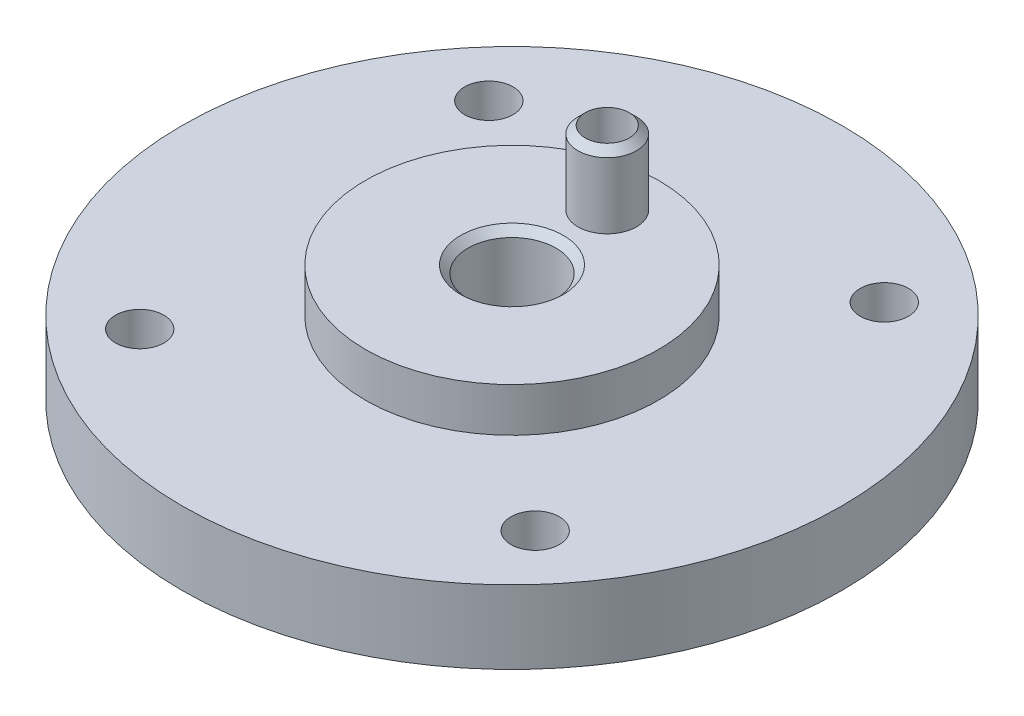
ISO-10303-21;
HEADER;
FILE_DESCRIPTION(('STEP AP214'),'2;1');
FILE_NAME('part.step','',(''),(''),'','','');
FILE_SCHEMA(('AUTOMOTIVE_DESIGN { 1 0 10303 214 1 1 1 1 }'));
ENDSEC;
DATA;
#1=APPLICATION_CONTEXT('core data for automotive mechanical design processes');
#2=APPLICATION_PROTOCOL_DEFINITION('international standard','automotive_design',2000,#1);
#3=PRODUCT_CONTEXT('',#1,'mechanical');
#4=PRODUCT('Part','Part','',(#3));
#5=PRODUCT_RELATED_PRODUCT_CATEGORY('part','',(#4));
#6=PRODUCT_DEFINITION_FORMATION('','',#4);
#7=PRODUCT_DEFINITION_CONTEXT('part definition',#1,'design');
#8=PRODUCT_DEFINITION('design','',#6,#7);
#9=PRODUCT_DEFINITION_SHAPE('','',#8);
#10=(LENGTH_UNIT() NAMED_UNIT(*) SI_UNIT(.MILLI.,.METRE.));
#11=(NAMED_UNIT(*) PLANE_ANGLE_UNIT() SI_UNIT($,.RADIAN.));
#12=(NAMED_UNIT(*) SI_UNIT($,.STERADIAN.) SOLID_ANGLE_UNIT());
#13=UNCERTAINTY_MEASURE_WITH_UNIT(LENGTH_MEASURE(1.E-05),#10,'distance_accuracy_value','');
#14=(GEOMETRIC_REPRESENTATION_CONTEXT(3) GLOBAL_UNCERTAINTY_ASSIGNED_CONTEXT((#13)) GLOBAL_UNIT_ASSIGNED_CONTEXT((#10,
#11,#12)) REPRESENTATION_CONTEXT('',''));
#15=CARTESIAN_POINT('',(0.,0.,0.));
#16=DIRECTION('',(0.,0.,1.));
#17=DIRECTION('',(1.,0.,0.));
#18=AXIS2_PLACEMENT_3D('',#15,#16,#17);
#19=CARTESIAN_POINT('',(0.,8.,0.));
#20=DIRECTION('',(0.,1.,0.));
#21=DIRECTION('',(0.,0.,1.));
#22=AXIS2_PLACEMENT_3D('',#19,#20,#21);
#23=PLANE('',#22);
#24=CARTESIAN_POINT('',(0.,8.,0.));
#25=DIRECTION('',(0.,1.,0.));
#26=DIRECTION('',(0.,0.,1.));
#27=AXIS2_PLACEMENT_3D('',#24,#25,#26);
#28=CIRCLE('',#27,10.);
#29=CARTESIAN_POINT('',(0.,8.,10.));
#30=VERTEX_POINT('',#29);
#31=EDGE_CURVE('E127',#30,#30,#28,.T.);
#32=ORIENTED_EDGE('',*,*,#31,.T.);
#33=EDGE_LOOP('',(#32));
#34=FACE_BOUND('',#33,.T.);
#35=CARTESIAN_POINT('',(0.,8.,0.));
#36=DIRECTION('',(0.,1.,0.));
#37=DIRECTION('',(0.,0.,1.));
#38=AXIS2_PLACEMENT_3D('',#35,#36,#37);
#39=CIRCLE('',#38,3.49999999999999);
#40=CARTESIAN_POINT('',(0.,8.,3.49999999999999));
#41=VERTEX_POINT('',#40);
#42=EDGE_CURVE('E81',#41,#41,#39,.F.);
#43=ORIENTED_EDGE('',*,*,#42,.T.);
#44=EDGE_LOOP('',(#43));
#45=FACE_BOUND('',#44,.T.);
#46=CARTESIAN_POINT('',(0.,8.,-6.5));
#47=DIRECTION('',(0.,1.,0.));
#48=DIRECTION('',(0.,0.,1.));
#49=AXIS2_PLACEMENT_3D('',#46,#47,#48);
#50=CIRCLE('',#49,2.);
#51=CARTESIAN_POINT('',(0.,8.,-4.5));
#52=VERTEX_POINT('',#51);
#53=EDGE_CURVE('E163',#52,#52,#50,.T.);
#54=ORIENTED_EDGE('',*,*,#53,.F.);
#55=EDGE_LOOP('',(#54));
#56=FACE_BOUND('',#55,.T.);
#57=ADVANCED_FACE('F72',(#34,#45,#56),#23,.T.);
#58=CARTESIAN_POINT('',(0.,0.,0.));
#59=DIRECTION('',(0.,1.,0.));
#60=DIRECTION('',(0.,0.,1.));
#61=AXIS2_PLACEMENT_3D('',#58,#59,#60);
#62=PLANE('',#61);
#63=CARTESIAN_POINT('',(11.9133360356064,0.,-13.4934215269042));
#64=DIRECTION('',(0.,-1.,0.));
#65=DIRECTION('',(0.,0.,-1.));
#66=AXIS2_PLACEMENT_3D('',#63,#64,#65);
#67=CIRCLE('',#66,1.64999999999999);
#68=CARTESIAN_POINT('',(11.9133360356064,0.,-15.1434215269042));
#69=VERTEX_POINT('',#68);
#70=EDGE_CURVE('E155',#69,#69,#67,.T.);
#71=ORIENTED_EDGE('',*,*,#70,.F.);
#72=EDGE_LOOP('',(#71));
#73=FACE_BOUND('',#72,.T.);
#74=CARTESIAN_POINT('',(13.4934215269042,0.,11.9133360356064));
#75=DIRECTION('',(0.,-1.,0.));
#76=DIRECTION('',(0.,0.,-1.));
#77=AXIS2_PLACEMENT_3D('',#74,#75,#76);
#78=CIRCLE('',#77,1.64999999999999);
#79=CARTESIAN_POINT('',(13.4934215269042,0.,10.2633360356064));
#80=VERTEX_POINT('',#79);
#81=EDGE_CURVE('E111',#80,#80,#78,.T.);
#82=ORIENTED_EDGE('',*,*,#81,.F.);
#83=EDGE_LOOP('',(#82));
#84=FACE_BOUND('',#83,.T.);
#85=CARTESIAN_POINT('',(-11.9133360356064,0.,13.4934215269042));
#86=DIRECTION('',(0.,-1.,0.));
#87=DIRECTION('',(0.,0.,-1.));
#88=AXIS2_PLACEMENT_3D('',#85,#86,#87);
#89=CIRCLE('',#88,1.64999999999999);
#90=CARTESIAN_POINT('',(-11.9133360356064,0.,11.8434215269042));
#91=VERTEX_POINT('',#90);
#92=EDGE_CURVE('E110',#91,#91,#89,.T.);
#93=ORIENTED_EDGE('',*,*,#92,.F.);
#94=EDGE_LOOP('',(#93));
#95=FACE_BOUND('',#94,.T.);
#96=CARTESIAN_POINT('',(0.,0.,0.));
#97=DIRECTION('',(0.,-1.,0.));
#98=DIRECTION('',(0.,0.,-1.));
#99=AXIS2_PLACEMENT_3D('',#96,#97,#98);
#100=CIRCLE('',#99,10.);
#101=CARTESIAN_POINT('',(0.,0.,-10.));
#102=VERTEX_POINT('',#101);
#103=EDGE_CURVE('E120',#102,#102,#100,.T.);
#104=ORIENTED_EDGE('',*,*,#103,.F.);
#105=EDGE_LOOP('',(#104));
#106=FACE_BOUND('',#105,.T.);
#107=CARTESIAN_POINT('',(0.,0.,0.));
#108=DIRECTION('',(0.,1.,0.));
#109=DIRECTION('',(0.,0.,1.));
#110=AXIS2_PLACEMENT_3D('',#107,#108,#109);
#111=CIRCLE('',#110,22.5);
#112=CARTESIAN_POINT('',(0.,0.,22.5));
#113=VERTEX_POINT('',#112);
#114=EDGE_CURVE('E112',#113,#113,#111,.T.);
#115=ORIENTED_EDGE('',*,*,#114,.F.);
#116=EDGE_LOOP('',(#115));
#117=FACE_BOUND('',#116,.T.);
#118=CARTESIAN_POINT('',(-13.4934215269042,0.,-11.9133360356064));
#119=DIRECTION('',(0.,-1.,0.));
#120=DIRECTION('',(0.,0.,-1.));
#121=AXIS2_PLACEMENT_3D('',#118,#119,#120);
#122=CIRCLE('',#121,1.64999999999999);
#123=CARTESIAN_POINT('',(-13.4934215269042,0.,-13.5633360356064));
#124=VERTEX_POINT('',#123);
#125=EDGE_CURVE('E138',#124,#124,#122,.T.);
#126=ORIENTED_EDGE('',*,*,#125,.F.);
#127=EDGE_LOOP('',(#126));
#128=FACE_BOUND('',#127,.T.);
#129=ADVANCED_FACE('F183',(#73,#84,#95,#106,#117,#128),#62,.F.);
#130=CARTESIAN_POINT('',(0.,5.,0.));
#131=DIRECTION('',(0.,-1.,0.));
#132=DIRECTION('',(0.,0.,-1.));
#133=AXIS2_PLACEMENT_3D('',#130,#131,#132);
#134=CYLINDRICAL_SURFACE('',#133,22.5);
#135=CARTESIAN_POINT('',(0.,5.,0.));
#136=DIRECTION('',(0.,1.,0.));
#137=DIRECTION('',(0.,0.,1.));
#138=AXIS2_PLACEMENT_3D('',#135,#136,#137);
#139=CIRCLE('',#138,22.5);
#140=CARTESIAN_POINT('',(0.,5.,22.5));
#141=VERTEX_POINT('',#140);
#142=EDGE_CURVE('E115',#141,#141,#139,.T.);
#143=ORIENTED_EDGE('',*,*,#142,.F.);
#144=EDGE_LOOP('',(#143));
#145=FACE_BOUND('',#144,.T.);
#146=ORIENTED_EDGE('',*,*,#114,.T.);
#147=EDGE_LOOP('',(#146));
#148=FACE_BOUND('',#147,.T.);
#149=ADVANCED_FACE('F188',(#145,#148),#134,.T.);
#150=CARTESIAN_POINT('',(0.,5.,0.));
#151=DIRECTION('',(0.,1.,0.));
#152=DIRECTION('',(0.,0.,1.));
#153=AXIS2_PLACEMENT_3D('',#150,#151,#152);
#154=PLANE('',#153);
#155=CARTESIAN_POINT('',(11.9133360356064,5.,-13.4934215269042));
#156=DIRECTION('',(0.,1.,0.));
#157=DIRECTION('',(0.,0.,1.));
#158=AXIS2_PLACEMENT_3D('',#155,#156,#157);
#159=CIRCLE('',#158,1.64999999999999);
#160=CARTESIAN_POINT('',(11.9133360356064,5.,-11.8434215269042));
#161=VERTEX_POINT('',#160);
#162=EDGE_CURVE('E152',#161,#161,#159,.T.);
#163=ORIENTED_EDGE('',*,*,#162,.F.);
#164=EDGE_LOOP('',(#163));
#165=FACE_BOUND('',#164,.T.);
#166=CARTESIAN_POINT('',(13.4934215269042,5.,11.9133360356064));
#167=DIRECTION('',(0.,1.,0.));
#168=DIRECTION('',(0.,0.,1.));
#169=AXIS2_PLACEMENT_3D('',#166,#167,#168);
#170=CIRCLE('',#169,1.64999999999999);
#171=CARTESIAN_POINT('',(13.4934215269042,5.,13.5633360356064));
#172=VERTEX_POINT('',#171);
#173=EDGE_CURVE('E106',#172,#172,#170,.T.);
#174=ORIENTED_EDGE('',*,*,#173,.F.);
#175=EDGE_LOOP('',(#174));
#176=FACE_BOUND('',#175,.T.);
#177=CARTESIAN_POINT('',(-11.9133360356064,5.,13.4934215269042));
#178=DIRECTION('',(0.,1.,0.));
#179=DIRECTION('',(0.,0.,1.));
#180=AXIS2_PLACEMENT_3D('',#177,#178,#179);
#181=CIRCLE('',#180,1.64999999999999);
#182=CARTESIAN_POINT('',(-11.9133360356064,5.,15.1434215269042));
#183=VERTEX_POINT('',#182);
#184=EDGE_CURVE('E142',#183,#183,#181,.T.);
#185=ORIENTED_EDGE('',*,*,#184,.F.);
#186=EDGE_LOOP('',(#185));
#187=FACE_BOUND('',#186,.T.);
#188=CARTESIAN_POINT('',(-13.4934215269042,5.,-11.9133360356064));
#189=DIRECTION('',(0.,1.,0.));
#190=DIRECTION('',(0.,0.,1.));
#191=AXIS2_PLACEMENT_3D('',#188,#189,#190);
#192=CIRCLE('',#191,1.64999999999999);
#193=CARTESIAN_POINT('',(-13.4934215269042,5.,-10.2633360356064));
#194=VERTEX_POINT('',#193);
#195=EDGE_CURVE('E134',#194,#194,#192,.T.);
#196=ORIENTED_EDGE('',*,*,#195,.F.);
#197=EDGE_LOOP('',(#196));
#198=FACE_BOUND('',#197,.T.);
#199=CARTESIAN_POINT('',(0.,5.,0.));
#200=DIRECTION('',(0.,1.,0.));
#201=DIRECTION('',(0.,0.,1.));
#202=AXIS2_PLACEMENT_3D('',#199,#200,#201);
#203=CIRCLE('',#202,10.);
#204=CARTESIAN_POINT('',(0.,5.,10.));
#205=VERTEX_POINT('',#204);
#206=EDGE_CURVE('E105',#205,#205,#203,.T.);
#207=ORIENTED_EDGE('',*,*,#206,.F.);
#208=EDGE_LOOP('',(#207));
#209=FACE_BOUND('',#208,.T.);
#210=ORIENTED_EDGE('',*,*,#142,.T.);
#211=EDGE_LOOP('',(#210));
#212=FACE_BOUND('',#211,.T.);
#213=ADVANCED_FACE('F206',(#165,#176,#187,#198,#209,#212),#154,.T.);
#214=CARTESIAN_POINT('',(0.,-5.,0.));
#215=DIRECTION('',(0.,1.,0.));
#216=DIRECTION('',(0.,0.,1.));
#217=AXIS2_PLACEMENT_3D('',#214,#215,#216);
#218=CYLINDRICAL_SURFACE('',#217,10.);
#219=CARTESIAN_POINT('',(0.,-5.,0.));
#220=DIRECTION('',(0.,-1.,0.));
#221=DIRECTION('',(0.,0.,-1.));
#222=AXIS2_PLACEMENT_3D('',#219,#220,#221);
#223=CIRCLE('',#222,10.);
#224=CARTESIAN_POINT('',(0.,-5.,-10.));
#225=VERTEX_POINT('',#224);
#226=EDGE_CURVE('E116',#225,#225,#223,.T.);
#227=ORIENTED_EDGE('',*,*,#226,.F.);
#228=EDGE_LOOP('',(#227));
#229=FACE_BOUND('',#228,.T.);
#230=ORIENTED_EDGE('',*,*,#103,.T.);
#231=EDGE_LOOP('',(#230));
#232=FACE_BOUND('',#231,.T.);
#233=ADVANCED_FACE('F202',(#229,#232),#218,.T.);
#234=CARTESIAN_POINT('',(0.,-5.,0.));
#235=DIRECTION('',(0.,-1.,0.));
#236=DIRECTION('',(0.,0.,-1.));
#237=AXIS2_PLACEMENT_3D('',#234,#235,#236);
#238=PLANE('',#237);
#239=CARTESIAN_POINT('',(0.,-5.,0.));
#240=DIRECTION('',(0.,-1.,0.));
#241=DIRECTION('',(0.,0.,-1.));
#242=AXIS2_PLACEMENT_3D('',#239,#240,#241);
#243=CIRCLE('',#242,3.5);
#244=CARTESIAN_POINT('',(0.,-5.,-3.5));
#245=VERTEX_POINT('',#244);
#246=EDGE_CURVE('E101',#245,#245,#243,.F.);
#247=ORIENTED_EDGE('',*,*,#246,.T.);
#248=EDGE_LOOP('',(#247));
#249=FACE_BOUND('',#248,.T.);
#250=CARTESIAN_POINT('',(0.,-5.,-6.5));
#251=DIRECTION('',(0.,1.,0.));
#252=DIRECTION('',(0.,0.,1.));
#253=AXIS2_PLACEMENT_3D('',#250,#251,#252);
#254=CIRCLE('',#253,1.5);
#255=CARTESIAN_POINT('',(0.,-5.,-5.));
#256=VERTEX_POINT('',#255);
#257=EDGE_CURVE('E159',#256,#256,#254,.T.);
#258=ORIENTED_EDGE('',*,*,#257,.T.);
#259=EDGE_LOOP('',(#258));
#260=FACE_BOUND('',#259,.T.);
#261=ORIENTED_EDGE('',*,*,#226,.T.);
#262=EDGE_LOOP('',(#261));
#263=FACE_BOUND('',#262,.T.);
#264=ADVANCED_FACE('F198',(#249,#260,#263),#238,.T.);
#265=CARTESIAN_POINT('',(0.,8.,0.));
#266=DIRECTION('',(0.,-1.,0.));
#267=DIRECTION('',(0.,0.,-1.));
#268=AXIS2_PLACEMENT_3D('',#265,#266,#267);
#269=CYLINDRICAL_SURFACE('',#268,10.);
#270=ORIENTED_EDGE('',*,*,#31,.F.);
#271=EDGE_LOOP('',(#270));
#272=FACE_BOUND('',#271,.T.);
#273=ORIENTED_EDGE('',*,*,#206,.T.);
#274=EDGE_LOOP('',(#273));
#275=FACE_BOUND('',#274,.T.);
#276=ADVANCED_FACE('F195',(#272,#275),#269,.T.);
#277=CARTESIAN_POINT('',(0.,-5.,0.));
#278=DIRECTION('',(0.,1.,0.));
#279=DIRECTION('',(0.,0.,1.));
#280=AXIS2_PLACEMENT_3D('',#277,#278,#279);
#281=CYLINDRICAL_SURFACE('',#280,3.);
#282=CARTESIAN_POINT('',(0.,-4.49999999999999,0.));
#283=DIRECTION('',(0.,-1.,0.));
#284=DIRECTION('',(0.,0.,-1.));
#285=AXIS2_PLACEMENT_3D('',#282,#283,#284);
#286=CIRCLE('',#285,3.);
#287=CARTESIAN_POINT('',(0.,-4.49999999999999,-3.));
#288=VERTEX_POINT('',#287);
#289=EDGE_CURVE('E89',#288,#288,#286,.T.);
#290=ORIENTED_EDGE('',*,*,#289,.T.);
#291=EDGE_LOOP('',(#290));
#292=FACE_BOUND('',#291,.T.);
#293=CARTESIAN_POINT('',(0.,7.50000000000001,0.));
#294=DIRECTION('',(0.,1.,0.));
#295=DIRECTION('',(0.,0.,1.));
#296=AXIS2_PLACEMENT_3D('',#293,#294,#295);
#297=CIRCLE('',#296,3.);
#298=CARTESIAN_POINT('',(0.,7.50000000000001,3.));
#299=VERTEX_POINT('',#298);
#300=EDGE_CURVE('E95',#299,#299,#297,.T.);
#301=ORIENTED_EDGE('',*,*,#300,.T.);
#302=EDGE_LOOP('',(#301));
#303=FACE_BOUND('',#302,.T.);
#304=ADVANCED_FACE('F193',(#292,#303),#281,.F.);
#305=CARTESIAN_POINT('',(-13.4934215269042,0.,-11.9133360356064));
#306=DIRECTION('',(0.,-1.,0.));
#307=DIRECTION('',(0.,0.,-1.));
#308=AXIS2_PLACEMENT_3D('',#305,#306,#307);
#309=CYLINDRICAL_SURFACE('',#308,1.64999999999999);
#310=ORIENTED_EDGE('',*,*,#195,.T.);
#311=EDGE_LOOP('',(#310));
#312=FACE_BOUND('',#311,.T.);
#313=ORIENTED_EDGE('',*,*,#125,.T.);
#314=EDGE_LOOP('',(#313));
#315=FACE_BOUND('',#314,.T.);
#316=ADVANCED_FACE('F230',(#312,#315),#309,.F.);
#317=CARTESIAN_POINT('',(-11.9133360356064,0.,13.4934215269042));
#318=DIRECTION('',(0.,-1.,0.));
#319=DIRECTION('',(0.,0.,-1.));
#320=AXIS2_PLACEMENT_3D('',#317,#318,#319);
#321=CYLINDRICAL_SURFACE('',#320,1.64999999999999);
#322=ORIENTED_EDGE('',*,*,#184,.T.);
#323=EDGE_LOOP('',(#322));
#324=FACE_BOUND('',#323,.T.);
#325=ORIENTED_EDGE('',*,*,#92,.T.);
#326=EDGE_LOOP('',(#325));
#327=FACE_BOUND('',#326,.T.);
#328=ADVANCED_FACE('F235',(#324,#327),#321,.F.);
#329=CARTESIAN_POINT('',(13.4934215269042,0.,11.9133360356064));
#330=DIRECTION('',(0.,-1.,0.));
#331=DIRECTION('',(0.,0.,-1.));
#332=AXIS2_PLACEMENT_3D('',#329,#330,#331);
#333=CYLINDRICAL_SURFACE('',#332,1.64999999999999);
#334=ORIENTED_EDGE('',*,*,#173,.T.);
#335=EDGE_LOOP('',(#334));
#336=FACE_BOUND('',#335,.T.);
#337=ORIENTED_EDGE('',*,*,#81,.T.);
#338=EDGE_LOOP('',(#337));
#339=FACE_BOUND('',#338,.T.);
#340=ADVANCED_FACE('F260',(#336,#339),#333,.F.);
#341=CARTESIAN_POINT('',(11.9133360356064,0.,-13.4934215269042));
#342=DIRECTION('',(0.,-1.,0.));
#343=DIRECTION('',(0.,0.,-1.));
#344=AXIS2_PLACEMENT_3D('',#341,#342,#343);
#345=CYLINDRICAL_SURFACE('',#344,1.64999999999999);
#346=ORIENTED_EDGE('',*,*,#162,.T.);
#347=EDGE_LOOP('',(#346));
#348=FACE_BOUND('',#347,.T.);
#349=ORIENTED_EDGE('',*,*,#70,.T.);
#350=EDGE_LOOP('',(#349));
#351=FACE_BOUND('',#350,.T.);
#352=ADVANCED_FACE('F255',(#348,#351),#345,.F.);
#353=CARTESIAN_POINT('',(0.,-5.,-6.5));
#354=DIRECTION('',(0.,1.,0.));
#355=DIRECTION('',(0.,0.,1.));
#356=AXIS2_PLACEMENT_3D('',#353,#354,#355);
#357=CYLINDRICAL_SURFACE('',#356,1.5);
#358=ORIENTED_EDGE('',*,*,#257,.F.);
#359=EDGE_LOOP('',(#358));
#360=FACE_BOUND('',#359,.T.);
#361=CARTESIAN_POINT('',(0.,13.,-6.5));
#362=DIRECTION('',(0.,1.,0.));
#363=DIRECTION('',(0.,0.,1.));
#364=AXIS2_PLACEMENT_3D('',#361,#362,#363);
#365=CIRCLE('',#364,1.5);
#366=CARTESIAN_POINT('',(0.,13.,-5.));
#367=VERTEX_POINT('',#366);
#368=EDGE_CURVE('E167',#367,#367,#365,.T.);
#369=ORIENTED_EDGE('',*,*,#368,.T.);
#370=EDGE_LOOP('',(#369));
#371=FACE_BOUND('',#370,.T.);
#372=ADVANCED_FACE('F173',(#360,#371),#357,.F.);
#373=CARTESIAN_POINT('',(0.,-5.,0.));
#374=DIRECTION('',(0.,-1.,0.));
#375=DIRECTION('',(0.,0.,-1.));
#376=AXIS2_PLACEMENT_3D('',#373,#374,#375);
#377=CONICAL_SURFACE('',#376,3.5,0.785398163397438);
#378=ORIENTED_EDGE('',*,*,#289,.F.);
#379=EDGE_LOOP('',(#378));
#380=FACE_BOUND('',#379,.T.);
#381=ORIENTED_EDGE('',*,*,#246,.F.);
#382=EDGE_LOOP('',(#381));
#383=FACE_BOUND('',#382,.T.);
#384=ADVANCED_FACE('F215',(#380,#383),#377,.F.);
#385=CARTESIAN_POINT('',(0.,7.50000000000001,0.));
#386=DIRECTION('',(0.,1.,0.));
#387=DIRECTION('',(0.,0.,1.));
#388=AXIS2_PLACEMENT_3D('',#385,#386,#387);
#389=CONICAL_SURFACE('',#388,3.,0.785398163397444);
#390=ORIENTED_EDGE('',*,*,#42,.F.);
#391=EDGE_LOOP('',(#390));
#392=FACE_BOUND('',#391,.T.);
#393=ORIENTED_EDGE('',*,*,#300,.F.);
#394=EDGE_LOOP('',(#393));
#395=FACE_BOUND('',#394,.T.);
#396=ADVANCED_FACE('F180',(#392,#395),#389,.F.);
#397=CARTESIAN_POINT('',(0.,13.,-6.5));
#398=DIRECTION('',(0.,-1.,0.));
#399=DIRECTION('',(0.,0.,-1.));
#400=AXIS2_PLACEMENT_3D('',#397,#398,#399);
#401=CYLINDRICAL_SURFACE('',#400,2.);
#402=CARTESIAN_POINT('',(0.,12.5,-6.5));
#403=DIRECTION('',(0.,1.,0.));
#404=DIRECTION('',(0.,0.,1.));
#405=AXIS2_PLACEMENT_3D('',#402,#403,#404);
#406=CIRCLE('',#405,2.);
#407=CARTESIAN_POINT('',(0.,12.5,-4.5));
#408=VERTEX_POINT('',#407);
#409=EDGE_CURVE('E12',#408,#408,#406,.F.);
#410=ORIENTED_EDGE('',*,*,#409,.T.);
#411=EDGE_LOOP('',(#410));
#412=FACE_BOUND('',#411,.T.);
#413=ORIENTED_EDGE('',*,*,#53,.T.);
#414=EDGE_LOOP('',(#413));
#415=FACE_BOUND('',#414,.T.);
#416=ADVANCED_FACE('F176',(#412,#415),#401,.T.);
#417=CARTESIAN_POINT('',(0.,13.,-6.5));
#418=DIRECTION('',(0.,-1.,0.));
#419=DIRECTION('',(0.,0.,-1.));
#420=AXIS2_PLACEMENT_3D('',#417,#418,#419);
#421=CONICAL_SURFACE('',#420,1.50000000000001,0.785398163397442);
#422=ORIENTED_EDGE('',*,*,#409,.F.);
#423=EDGE_LOOP('',(#422));
#424=FACE_BOUND('',#423,.T.);
#425=ORIENTED_EDGE('',*,*,#368,.F.);
#426=EDGE_LOOP('',(#425));
#427=FACE_BOUND('',#426,.T.);
#428=ADVANCED_FACE('F75',(#424,#427),#421,.T.);
#429=CLOSED_SHELL('',(#57,#129,#149,#213,#233,#264,#276,#304,#316,#328,#340,#352,#372,#384,#396,
#416,#428));
#430=MANIFOLD_SOLID_BREP('B2',#429);
#431=ADVANCED_BREP_SHAPE_REPRESENTATION('',(#18,#430),#14);
#432=SHAPE_DEFINITION_REPRESENTATION(#9,#431);
ENDSEC;
END-ISO-10303-21;
